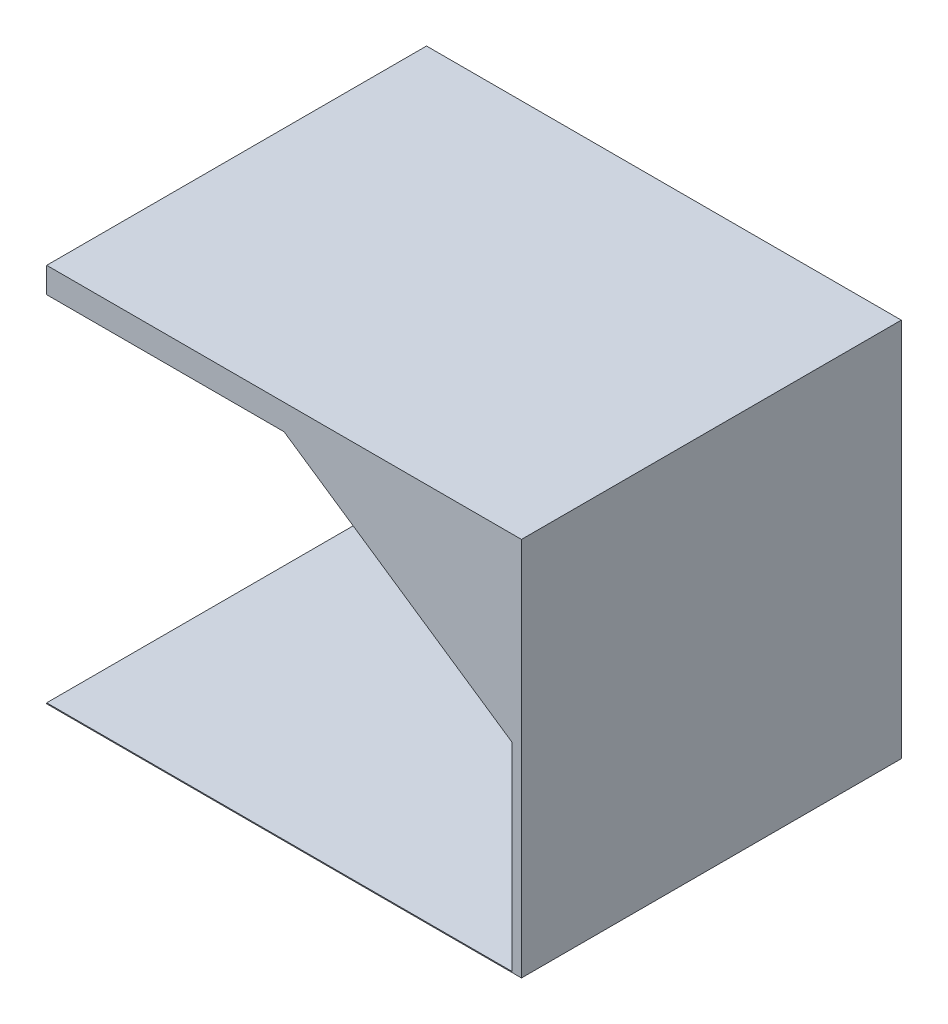
ISO-10303-21;
HEADER;
FILE_DESCRIPTION(('STEP AP214'),'2;1');
FILE_NAME('part.step','',(''),(''),'','','');
FILE_SCHEMA(('AUTOMOTIVE_DESIGN { 1 0 10303 214 1 1 1 1 }'));
ENDSEC;
DATA;
#1=APPLICATION_CONTEXT('core data for automotive mechanical design processes');
#2=APPLICATION_PROTOCOL_DEFINITION('international standard','automotive_design',2000,#1);
#3=PRODUCT_CONTEXT('',#1,'mechanical');
#4=PRODUCT('Part','Part','',(#3));
#5=PRODUCT_RELATED_PRODUCT_CATEGORY('part','',(#4));
#6=PRODUCT_DEFINITION_FORMATION('','',#4);
#7=PRODUCT_DEFINITION_CONTEXT('part definition',#1,'design');
#8=PRODUCT_DEFINITION('design','',#6,#7);
#9=PRODUCT_DEFINITION_SHAPE('','',#8);
#10=(LENGTH_UNIT() NAMED_UNIT(*) SI_UNIT(.MILLI.,.METRE.));
#11=(NAMED_UNIT(*) PLANE_ANGLE_UNIT() SI_UNIT($,.RADIAN.));
#12=(NAMED_UNIT(*) SI_UNIT($,.STERADIAN.) SOLID_ANGLE_UNIT());
#13=UNCERTAINTY_MEASURE_WITH_UNIT(LENGTH_MEASURE(1.E-05),#10,'distance_accuracy_value','');
#14=(GEOMETRIC_REPRESENTATION_CONTEXT(3) GLOBAL_UNCERTAINTY_ASSIGNED_CONTEXT((#13)) GLOBAL_UNIT_ASSIGNED_CONTEXT((#10,
#11,#12)) REPRESENTATION_CONTEXT('',''));
#15=CARTESIAN_POINT('',(0.,0.,0.));
#16=DIRECTION('',(0.,0.,1.));
#17=DIRECTION('',(1.,0.,0.));
#18=AXIS2_PLACEMENT_3D('',#15,#16,#17);
#19=CARTESIAN_POINT('',(-1250.,-1000.,2000.));
#20=DIRECTION('',(1.,0.,0.));
#21=DIRECTION('',(0.,0.,-1.));
#22=AXIS2_PLACEMENT_3D('',#19,#20,#21);
#23=PLANE('',#22);
#24=DIRECTION('',(0.,-1.,0.));
#25=VECTOR('',#24,1.);
#26=CARTESIAN_POINT('',(-1250.,-1000.,2000.));
#27=LINE('',#26,#25);
#28=CARTESIAN_POINT('',(-1250.,-995.,2000.));
#29=VERTEX_POINT('',#28);
#30=CARTESIAN_POINT('',(-1250.,-1000.,2000.));
#31=VERTEX_POINT('',#30);
#32=EDGE_CURVE('E84',#29,#31,#27,.T.);
#33=ORIENTED_EDGE('',*,*,#32,.F.);
#34=DIRECTION('',(0.,0.,-1.));
#35=VECTOR('',#34,1.);
#36=CARTESIAN_POINT('',(-1250.,-995.,2000.000012));
#37=LINE('',#36,#35);
#38=CARTESIAN_POINT('',(-1250.,-995.,4.99999999999989));
#39=VERTEX_POINT('',#38);
#40=EDGE_CURVE('E149',#29,#39,#37,.T.);
#41=ORIENTED_EDGE('',*,*,#40,.T.);
#42=DIRECTION('',(0.,-1.,0.));
#43=VECTOR('',#42,1.);
#44=CARTESIAN_POINT('',(-1250.,0.,4.99999999999989));
#45=LINE('',#44,#43);
#46=CARTESIAN_POINT('',(-1250.,865.900952838913,4.99999999999989));
#47=VERTEX_POINT('',#46);
#48=EDGE_CURVE('E134',#47,#39,#45,.T.);
#49=ORIENTED_EDGE('',*,*,#48,.F.);
#50=DIRECTION('',(0.,0.,-1.));
#51=VECTOR('',#50,1.);
#52=CARTESIAN_POINT('',(-1250.,865.900952838913,2000.000012));
#53=LINE('',#52,#51);
#54=CARTESIAN_POINT('',(-1250.,865.900952838913,2000.));
#55=VERTEX_POINT('',#54);
#56=EDGE_CURVE('E151',#55,#47,#53,.T.);
#57=ORIENTED_EDGE('',*,*,#56,.F.);
#58=CARTESIAN_POINT('',(-1250.,1000.,2000.));
#59=VERTEX_POINT('',#58);
#60=EDGE_CURVE('E155',#59,#55,#27,.T.);
#61=ORIENTED_EDGE('',*,*,#60,.F.);
#62=DIRECTION('',(0.,0.,-1.));
#63=VECTOR('',#62,1.);
#64=CARTESIAN_POINT('',(-1250.,1000.,2000.));
#65=LINE('',#64,#63);
#66=CARTESIAN_POINT('',(-1250.,1000.,0.));
#67=VERTEX_POINT('',#66);
#68=EDGE_CURVE('E162',#59,#67,#65,.T.);
#69=ORIENTED_EDGE('',*,*,#68,.T.);
#70=DIRECTION('',(0.,-1.,0.));
#71=VECTOR('',#70,1.);
#72=CARTESIAN_POINT('',(-1250.,-1000.,0.));
#73=LINE('',#72,#71);
#74=CARTESIAN_POINT('',(-1250.,-1000.,0.));
#75=VERTEX_POINT('',#74);
#76=EDGE_CURVE('E119',#67,#75,#73,.T.);
#77=ORIENTED_EDGE('',*,*,#76,.T.);
#78=DIRECTION('',(0.,0.,-1.));
#79=VECTOR('',#78,1.);
#80=CARTESIAN_POINT('',(-1250.,-1000.,2000.));
#81=LINE('',#80,#79);
#82=EDGE_CURVE('E176',#31,#75,#81,.T.);
#83=ORIENTED_EDGE('',*,*,#82,.F.);
#84=EDGE_LOOP('',(#33,#41,#49,#57,#61,#69,#77,#83));
#85=FACE_BOUND('',#84,.T.);
#86=ADVANCED_FACE('F33',(#85),#23,.F.);
#87=CARTESIAN_POINT('',(1250.,-1000.,2000.));
#88=DIRECTION('',(0.,1.,0.));
#89=DIRECTION('',(-1.,0.,0.));
#90=AXIS2_PLACEMENT_3D('',#87,#88,#89);
#91=PLANE('',#90);
#92=DIRECTION('',(1.,0.,0.));
#93=VECTOR('',#92,1.);
#94=CARTESIAN_POINT('',(1250.,-1000.,0.));
#95=LINE('',#94,#93);
#96=CARTESIAN_POINT('',(1250.,-1000.,0.));
#97=VERTEX_POINT('',#96);
#98=EDGE_CURVE('E165',#75,#97,#95,.T.);
#99=ORIENTED_EDGE('',*,*,#98,.T.);
#100=DIRECTION('',(0.,0.,-1.));
#101=VECTOR('',#100,1.);
#102=CARTESIAN_POINT('',(1250.,-1000.,2000.));
#103=LINE('',#102,#101);
#104=CARTESIAN_POINT('',(1250.,-1000.,2000.));
#105=VERTEX_POINT('',#104);
#106=EDGE_CURVE('E173',#105,#97,#103,.T.);
#107=ORIENTED_EDGE('',*,*,#106,.F.);
#108=DIRECTION('',(1.,0.,0.));
#109=VECTOR('',#108,1.);
#110=CARTESIAN_POINT('',(1250.,-1000.,2000.));
#111=LINE('',#110,#109);
#112=EDGE_CURVE('E157',#31,#105,#111,.T.);
#113=ORIENTED_EDGE('',*,*,#112,.F.);
#114=ORIENTED_EDGE('',*,*,#82,.T.);
#115=EDGE_LOOP('',(#99,#107,#113,#114));
#116=FACE_BOUND('',#115,.T.);
#117=ADVANCED_FACE('F194',(#116),#91,.F.);
#118=CARTESIAN_POINT('',(1250.,-1000.,2000.));
#119=DIRECTION('',(-1.,0.,0.));
#120=DIRECTION('',(0.,-1.,0.));
#121=AXIS2_PLACEMENT_3D('',#118,#119,#120);
#122=PLANE('',#121);
#123=DIRECTION('',(0.,1.,0.));
#124=VECTOR('',#123,1.);
#125=CARTESIAN_POINT('',(1250.,-1000.,0.));
#126=LINE('',#125,#124);
#127=CARTESIAN_POINT('',(1250.,1000.,0.));
#128=VERTEX_POINT('',#127);
#129=EDGE_CURVE('E167',#97,#128,#126,.T.);
#130=ORIENTED_EDGE('',*,*,#129,.T.);
#131=DIRECTION('',(0.,0.,-1.));
#132=VECTOR('',#131,1.);
#133=CARTESIAN_POINT('',(1250.,1000.,2000.));
#134=LINE('',#133,#132);
#135=CARTESIAN_POINT('',(1250.,1000.,2000.));
#136=VERTEX_POINT('',#135);
#137=EDGE_CURVE('E171',#136,#128,#134,.T.);
#138=ORIENTED_EDGE('',*,*,#137,.F.);
#139=DIRECTION('',(0.,1.,0.));
#140=VECTOR('',#139,1.);
#141=CARTESIAN_POINT('',(1250.,-1000.,2000.));
#142=LINE('',#141,#140);
#143=EDGE_CURVE('E159',#105,#136,#142,.T.);
#144=ORIENTED_EDGE('',*,*,#143,.F.);
#145=ORIENTED_EDGE('',*,*,#106,.T.);
#146=EDGE_LOOP('',(#130,#138,#144,#145));
#147=FACE_BOUND('',#146,.T.);
#148=ADVANCED_FACE('F199',(#147),#122,.F.);
#149=CARTESIAN_POINT('',(1250.,1000.,2000.));
#150=DIRECTION('',(0.,-1.,0.));
#151=DIRECTION('',(1.,0.,0.));
#152=AXIS2_PLACEMENT_3D('',#149,#150,#151);
#153=PLANE('',#152);
#154=DIRECTION('',(-1.,0.,0.));
#155=VECTOR('',#154,1.);
#156=CARTESIAN_POINT('',(1250.,1000.,0.));
#157=LINE('',#156,#155);
#158=EDGE_CURVE('E77',#128,#67,#157,.T.);
#159=ORIENTED_EDGE('',*,*,#158,.T.);
#160=ORIENTED_EDGE('',*,*,#68,.F.);
#161=DIRECTION('',(-1.,0.,0.));
#162=VECTOR('',#161,1.);
#163=CARTESIAN_POINT('',(1250.,1000.,2000.));
#164=LINE('',#163,#162);
#165=EDGE_CURVE('E56',#136,#59,#164,.T.);
#166=ORIENTED_EDGE('',*,*,#165,.F.);
#167=ORIENTED_EDGE('',*,*,#137,.T.);
#168=EDGE_LOOP('',(#159,#160,#166,#167));
#169=FACE_BOUND('',#168,.T.);
#170=ADVANCED_FACE('F201',(#169),#153,.F.);
#171=CARTESIAN_POINT('',(0.,0.,2000.));
#172=DIRECTION('',(0.,0.,1.));
#173=DIRECTION('',(1.,0.,0.));
#174=AXIS2_PLACEMENT_3D('',#171,#172,#173);
#175=PLANE('',#174);
#176=DIRECTION('',(1.,0.,0.));
#177=VECTOR('',#176,1.);
#178=CARTESIAN_POINT('',(-1.84111984917005E-12,-995.000000000002,2000.));
#179=LINE('',#178,#177);
#180=CARTESIAN_POINT('',(1200.,-995.,2000.));
#181=VERTEX_POINT('',#180);
#182=EDGE_CURVE('E11',#29,#181,#179,.T.);
#183=ORIENTED_EDGE('',*,*,#182,.F.);
#184=ORIENTED_EDGE('',*,*,#32,.T.);
#185=ORIENTED_EDGE('',*,*,#112,.T.);
#186=ORIENTED_EDGE('',*,*,#143,.T.);
#187=ORIENTED_EDGE('',*,*,#165,.T.);
#188=ORIENTED_EDGE('',*,*,#60,.T.);
#189=DIRECTION('',(1.,0.,0.));
#190=VECTOR('',#189,1.);
#191=CARTESIAN_POINT('',(-1.5381490798186E-13,865.900952838913,2000.));
#192=LINE('',#191,#190);
#193=CARTESIAN_POINT('',(0.,865.900952838913,2000.));
#194=VERTEX_POINT('',#193);
#195=EDGE_CURVE('E179',#55,#194,#192,.T.);
#196=ORIENTED_EDGE('',*,*,#195,.T.);
#197=DIRECTION('',(-0.827118673421249,0.562027312572862,0.));
#198=VECTOR('',#197,1.);
#199=CARTESIAN_POINT('',(402.525561596045,592.384749063777,2000.));
#200=LINE('',#199,#198);
#201=CARTESIAN_POINT('',(1200.,50.5007004207842,2000.));
#202=VERTEX_POINT('',#201);
#203=EDGE_CURVE('E182',#202,#194,#200,.T.);
#204=ORIENTED_EDGE('',*,*,#203,.F.);
#205=DIRECTION('',(0.,1.,0.));
#206=VECTOR('',#205,1.);
#207=CARTESIAN_POINT('',(1200.,-2.54857338500871E-13,2000.));
#208=LINE('',#207,#206);
#209=EDGE_CURVE('E40',#181,#202,#208,.T.);
#210=ORIENTED_EDGE('',*,*,#209,.F.);
#211=EDGE_LOOP('',(#183,#184,#185,#186,#187,#188,#196,#204,#210));
#212=FACE_BOUND('',#211,.T.);
#213=ADVANCED_FACE('F186',(#212),#175,.T.);
#214=CARTESIAN_POINT('',(0.,0.,0.));
#215=DIRECTION('',(0.,0.,1.));
#216=DIRECTION('',(1.,0.,0.));
#217=AXIS2_PLACEMENT_3D('',#214,#215,#216);
#218=PLANE('',#217);
#219=ORIENTED_EDGE('',*,*,#76,.F.);
#220=ORIENTED_EDGE('',*,*,#158,.F.);
#221=ORIENTED_EDGE('',*,*,#129,.F.);
#222=ORIENTED_EDGE('',*,*,#98,.F.);
#223=EDGE_LOOP('',(#219,#220,#221,#222));
#224=FACE_BOUND('',#223,.T.);
#225=ADVANCED_FACE('F203',(#224),#218,.F.);
#226=CARTESIAN_POINT('',(-1.84111984917005E-12,-995.000000000002,2000.000012));
#227=DIRECTION('',(0.,-1.,0.));
#228=DIRECTION('',(1.,0.,0.));
#229=AXIS2_PLACEMENT_3D('',#226,#227,#228);
#230=PLANE('',#229);
#231=ORIENTED_EDGE('',*,*,#182,.T.);
#232=DIRECTION('',(0.,0.,-1.));
#233=VECTOR('',#232,1.);
#234=CARTESIAN_POINT('',(1200.,-995.,2000.000012));
#235=LINE('',#234,#233);
#236=CARTESIAN_POINT('',(1200.,-995.,4.99999999999989));
#237=VERTEX_POINT('',#236);
#238=EDGE_CURVE('E111',#181,#237,#235,.T.);
#239=ORIENTED_EDGE('',*,*,#238,.T.);
#240=DIRECTION('',(-1.,0.,0.));
#241=VECTOR('',#240,1.);
#242=CARTESIAN_POINT('',(-1.84111984917005E-12,-995.000000000002,4.99999999999989));
#243=LINE('',#242,#241);
#244=EDGE_CURVE('E115',#237,#39,#243,.T.);
#245=ORIENTED_EDGE('',*,*,#244,.T.);
#246=ORIENTED_EDGE('',*,*,#40,.F.);
#247=EDGE_LOOP('',(#231,#239,#245,#246));
#248=FACE_BOUND('',#247,.T.);
#249=ADVANCED_FACE('F113',(#248),#230,.F.);
#250=CARTESIAN_POINT('',(1200.,-2.54857338500871E-13,2000.000012));
#251=DIRECTION('',(1.,0.,0.));
#252=DIRECTION('',(0.,1.,0.));
#253=AXIS2_PLACEMENT_3D('',#250,#251,#252);
#254=PLANE('',#253);
#255=ORIENTED_EDGE('',*,*,#209,.T.);
#256=DIRECTION('',(0.,0.,-1.));
#257=VECTOR('',#256,1.);
#258=CARTESIAN_POINT('',(1200.,50.5007004207842,2000.000012));
#259=LINE('',#258,#257);
#260=CARTESIAN_POINT('',(1200.,50.5007004207842,4.99999999999989));
#261=VERTEX_POINT('',#260);
#262=EDGE_CURVE('E120',#202,#261,#259,.T.);
#263=ORIENTED_EDGE('',*,*,#262,.T.);
#264=DIRECTION('',(0.,-1.,0.));
#265=VECTOR('',#264,1.);
#266=CARTESIAN_POINT('',(1200.,-2.54857338500871E-13,4.99999999999989));
#267=LINE('',#266,#265);
#268=EDGE_CURVE('E123',#261,#237,#267,.T.);
#269=ORIENTED_EDGE('',*,*,#268,.T.);
#270=ORIENTED_EDGE('',*,*,#238,.F.);
#271=EDGE_LOOP('',(#255,#263,#269,#270));
#272=FACE_BOUND('',#271,.T.);
#273=ADVANCED_FACE('F124',(#272),#254,.F.);
#274=CARTESIAN_POINT('',(402.525561596045,592.384749063777,2000.000012));
#275=DIRECTION('',(0.562027312572862,0.827118673421249,0.));
#276=DIRECTION('',(-0.827118673421249,0.562027312572862,0.));
#277=AXIS2_PLACEMENT_3D('',#274,#275,#276);
#278=PLANE('',#277);
#279=CARTESIAN_POINT('',(600.,458.200826629849,1500.));
#280=DIRECTION('',(-0.562027312572862,-0.827118673421249,0.));
#281=DIRECTION('',(0.827118673421249,-0.562027312572862,0.));
#282=AXIS2_PLACEMENT_3D('',#279,#280,#281);
#283=CIRCLE('',#282,100.);
#284=CARTESIAN_POINT('',(682.711867342125,401.998095372563,1500.));
#285=VERTEX_POINT('',#284);
#286=EDGE_CURVE('E139',#285,#285,#283,.T.);
#287=ORIENTED_EDGE('',*,*,#286,.F.);
#288=EDGE_LOOP('',(#287));
#289=FACE_BOUND('',#288,.T.);
#290=CARTESIAN_POINT('',(600.,458.200826629849,1002.5));
#291=DIRECTION('',(-0.562027312572862,-0.827118673421249,0.));
#292=DIRECTION('',(0.827118673421249,-0.562027312572862,0.));
#293=AXIS2_PLACEMENT_3D('',#290,#291,#292);
#294=CIRCLE('',#293,100.);
#295=CARTESIAN_POINT('',(682.711867342125,401.998095372563,1002.5));
#296=VERTEX_POINT('',#295);
#297=EDGE_CURVE('E344',#296,#296,#294,.T.);
#298=ORIENTED_EDGE('',*,*,#297,.F.);
#299=EDGE_LOOP('',(#298));
#300=FACE_BOUND('',#299,.T.);
#301=CARTESIAN_POINT('',(600.,458.200826629849,500.));
#302=DIRECTION('',(-0.562027312572862,-0.827118673421249,0.));
#303=DIRECTION('',(0.827118673421249,-0.562027312572862,0.));
#304=AXIS2_PLACEMENT_3D('',#301,#302,#303);
#305=CIRCLE('',#304,100.);
#306=CARTESIAN_POINT('',(682.711867342125,401.998095372563,500.));
#307=VERTEX_POINT('',#306);
#308=EDGE_CURVE('E142',#307,#307,#305,.T.);
#309=ORIENTED_EDGE('',*,*,#308,.F.);
#310=EDGE_LOOP('',(#309));
#311=FACE_BOUND('',#310,.T.);
#312=ORIENTED_EDGE('',*,*,#203,.T.);
#313=DIRECTION('',(0.,0.,-1.));
#314=VECTOR('',#313,1.);
#315=CARTESIAN_POINT('',(0.,865.900952838913,2000.000012));
#316=LINE('',#315,#314);
#317=CARTESIAN_POINT('',(0.,865.900952838913,4.99999999999989));
#318=VERTEX_POINT('',#317);
#319=EDGE_CURVE('E47',#194,#318,#316,.T.);
#320=ORIENTED_EDGE('',*,*,#319,.T.);
#321=DIRECTION('',(0.827118673421249,-0.562027312572862,0.));
#322=VECTOR('',#321,1.);
#323=CARTESIAN_POINT('',(402.525561596045,592.384749063777,4.99999999999989));
#324=LINE('',#323,#322);
#325=EDGE_CURVE('E129',#318,#261,#324,.T.);
#326=ORIENTED_EDGE('',*,*,#325,.T.);
#327=ORIENTED_EDGE('',*,*,#262,.F.);
#328=EDGE_LOOP('',(#312,#320,#326,#327));
#329=FACE_BOUND('',#328,.T.);
#330=ADVANCED_FACE('F185',(#289,#300,#311,#329),#278,.F.);
#331=CARTESIAN_POINT('',(-1.5381490798186E-13,865.900952838913,2000.000012));
#332=DIRECTION('',(0.,-1.,0.));
#333=DIRECTION('',(1.,0.,0.));
#334=AXIS2_PLACEMENT_3D('',#331,#332,#333);
#335=PLANE('',#334);
#336=ORIENTED_EDGE('',*,*,#56,.T.);
#337=DIRECTION('',(-1.,0.,0.));
#338=VECTOR('',#337,1.);
#339=CARTESIAN_POINT('',(-1.5381490798186E-13,865.900952838913,4.99999999999989));
#340=LINE('',#339,#338);
#341=EDGE_CURVE('E146',#318,#47,#340,.T.);
#342=ORIENTED_EDGE('',*,*,#341,.F.);
#343=ORIENTED_EDGE('',*,*,#319,.F.);
#344=ORIENTED_EDGE('',*,*,#195,.F.);
#345=EDGE_LOOP('',(#336,#342,#343,#344));
#346=FACE_BOUND('',#345,.T.);
#347=ADVANCED_FACE('F189',(#346),#335,.T.);
#348=CARTESIAN_POINT('',(0.,0.,4.99999999999989));
#349=DIRECTION('',(0.,0.,1.));
#350=DIRECTION('',(1.,0.,0.));
#351=AXIS2_PLACEMENT_3D('',#348,#349,#350);
#352=PLANE('',#351);
#353=ORIENTED_EDGE('',*,*,#244,.F.);
#354=ORIENTED_EDGE('',*,*,#268,.F.);
#355=ORIENTED_EDGE('',*,*,#325,.F.);
#356=ORIENTED_EDGE('',*,*,#341,.T.);
#357=ORIENTED_EDGE('',*,*,#48,.T.);
#358=EDGE_LOOP('',(#353,#354,#355,#356,#357));
#359=FACE_BOUND('',#358,.T.);
#360=ADVANCED_FACE('F131',(#359),#352,.T.);
#361=CARTESIAN_POINT('',(611.240546251457,474.743200098274,500.));
#362=DIRECTION('',(-0.562027312572862,-0.827118673421249,0.));
#363=DIRECTION('',(0.827118673421249,-0.562027312572862,0.));
#364=AXIS2_PLACEMENT_3D('',#361,#362,#363);
#365=CYLINDRICAL_SURFACE('',#364,100.);
#366=CARTESIAN_POINT('',(611.240546251457,474.743200098274,500.));
#367=DIRECTION('',(-0.562027312572862,-0.827118673421249,0.));
#368=DIRECTION('',(0.827118673421249,-0.562027312572862,0.));
#369=AXIS2_PLACEMENT_3D('',#366,#367,#368);
#370=CIRCLE('',#369,100.);
#371=CARTESIAN_POINT('',(693.952413593582,418.540468840988,500.));
#372=VERTEX_POINT('',#371);
#373=EDGE_CURVE('E348',#372,#372,#370,.T.);
#374=ORIENTED_EDGE('',*,*,#373,.F.);
#375=EDGE_LOOP('',(#374));
#376=FACE_BOUND('',#375,.T.);
#377=ORIENTED_EDGE('',*,*,#308,.T.);
#378=EDGE_LOOP('',(#377));
#379=FACE_BOUND('',#378,.T.);
#380=ADVANCED_FACE('F267',(#376,#379),#365,.F.);
#381=CARTESIAN_POINT('',(611.240546251457,474.743200098274,500.));
#382=DIRECTION('',(-0.562027312572862,-0.827118673421249,0.));
#383=DIRECTION('',(0.827118673421249,-0.562027312572862,0.));
#384=AXIS2_PLACEMENT_3D('',#381,#382,#383);
#385=PLANE('',#384);
#386=ORIENTED_EDGE('',*,*,#373,.T.);
#387=EDGE_LOOP('',(#386));
#388=FACE_BOUND('',#387,.T.);
#389=ADVANCED_FACE('F283',(#388),#385,.T.);
#390=CARTESIAN_POINT('',(611.240546251457,474.743200098274,1002.5));
#391=DIRECTION('',(-0.562027312572862,-0.827118673421249,0.));
#392=DIRECTION('',(0.827118673421249,-0.562027312572862,0.));
#393=AXIS2_PLACEMENT_3D('',#390,#391,#392);
#394=CYLINDRICAL_SURFACE('',#393,100.);
#395=CARTESIAN_POINT('',(611.240546251457,474.743200098274,1002.5));
#396=DIRECTION('',(-0.562027312572862,-0.827118673421249,0.));
#397=DIRECTION('',(0.827118673421249,-0.562027312572862,0.));
#398=AXIS2_PLACEMENT_3D('',#395,#396,#397);
#399=CIRCLE('',#398,100.);
#400=CARTESIAN_POINT('',(693.952413593582,418.540468840988,1002.5));
#401=VERTEX_POINT('',#400);
#402=EDGE_CURVE('E341',#401,#401,#399,.T.);
#403=ORIENTED_EDGE('',*,*,#402,.F.);
#404=EDGE_LOOP('',(#403));
#405=FACE_BOUND('',#404,.T.);
#406=ORIENTED_EDGE('',*,*,#297,.T.);
#407=EDGE_LOOP('',(#406));
#408=FACE_BOUND('',#407,.T.);
#409=ADVANCED_FACE('F293',(#405,#408),#394,.F.);
#410=CARTESIAN_POINT('',(611.240546251457,474.743200098274,1002.5));
#411=DIRECTION('',(-0.562027312572862,-0.827118673421249,0.));
#412=DIRECTION('',(0.827118673421249,-0.562027312572862,0.));
#413=AXIS2_PLACEMENT_3D('',#410,#411,#412);
#414=PLANE('',#413);
#415=ORIENTED_EDGE('',*,*,#402,.T.);
#416=EDGE_LOOP('',(#415));
#417=FACE_BOUND('',#416,.T.);
#418=ADVANCED_FACE('F303',(#417),#414,.T.);
#419=CARTESIAN_POINT('',(611.240546251457,474.743200098274,1500.));
#420=DIRECTION('',(-0.562027312572862,-0.827118673421249,0.));
#421=DIRECTION('',(0.827118673421249,-0.562027312572862,0.));
#422=AXIS2_PLACEMENT_3D('',#419,#420,#421);
#423=CYLINDRICAL_SURFACE('',#422,100.);
#424=CARTESIAN_POINT('',(611.240546251457,474.743200098274,1500.));
#425=DIRECTION('',(-0.562027312572862,-0.827118673421249,0.));
#426=DIRECTION('',(0.827118673421249,-0.562027312572862,0.));
#427=AXIS2_PLACEMENT_3D('',#424,#425,#426);
#428=CIRCLE('',#427,100.);
#429=CARTESIAN_POINT('',(693.952413593582,418.540468840988,1500.));
#430=VERTEX_POINT('',#429);
#431=EDGE_CURVE('E136',#430,#430,#428,.T.);
#432=ORIENTED_EDGE('',*,*,#431,.F.);
#433=EDGE_LOOP('',(#432));
#434=FACE_BOUND('',#433,.T.);
#435=ORIENTED_EDGE('',*,*,#286,.T.);
#436=EDGE_LOOP('',(#435));
#437=FACE_BOUND('',#436,.T.);
#438=ADVANCED_FACE('F313',(#434,#437),#423,.F.);
#439=CARTESIAN_POINT('',(611.240546251457,474.743200098274,1500.));
#440=DIRECTION('',(-0.562027312572862,-0.827118673421249,0.));
#441=DIRECTION('',(0.827118673421249,-0.562027312572862,0.));
#442=AXIS2_PLACEMENT_3D('',#439,#440,#441);
#443=PLANE('',#442);
#444=ORIENTED_EDGE('',*,*,#431,.T.);
#445=EDGE_LOOP('',(#444));
#446=FACE_BOUND('',#445,.T.);
#447=ADVANCED_FACE('F323',(#446),#443,.T.);
#448=CLOSED_SHELL('',(#86,#117,#148,#170,#213,#225,#249,#273,#330,#347,#360,#380,#389,#409,#418,
#438,#447));
#449=MANIFOLD_SOLID_BREP('B2',#448);
#450=ADVANCED_BREP_SHAPE_REPRESENTATION('',(#18,#449),#14);
#451=SHAPE_DEFINITION_REPRESENTATION(#9,#450);
ENDSEC;
END-ISO-10303-21;
